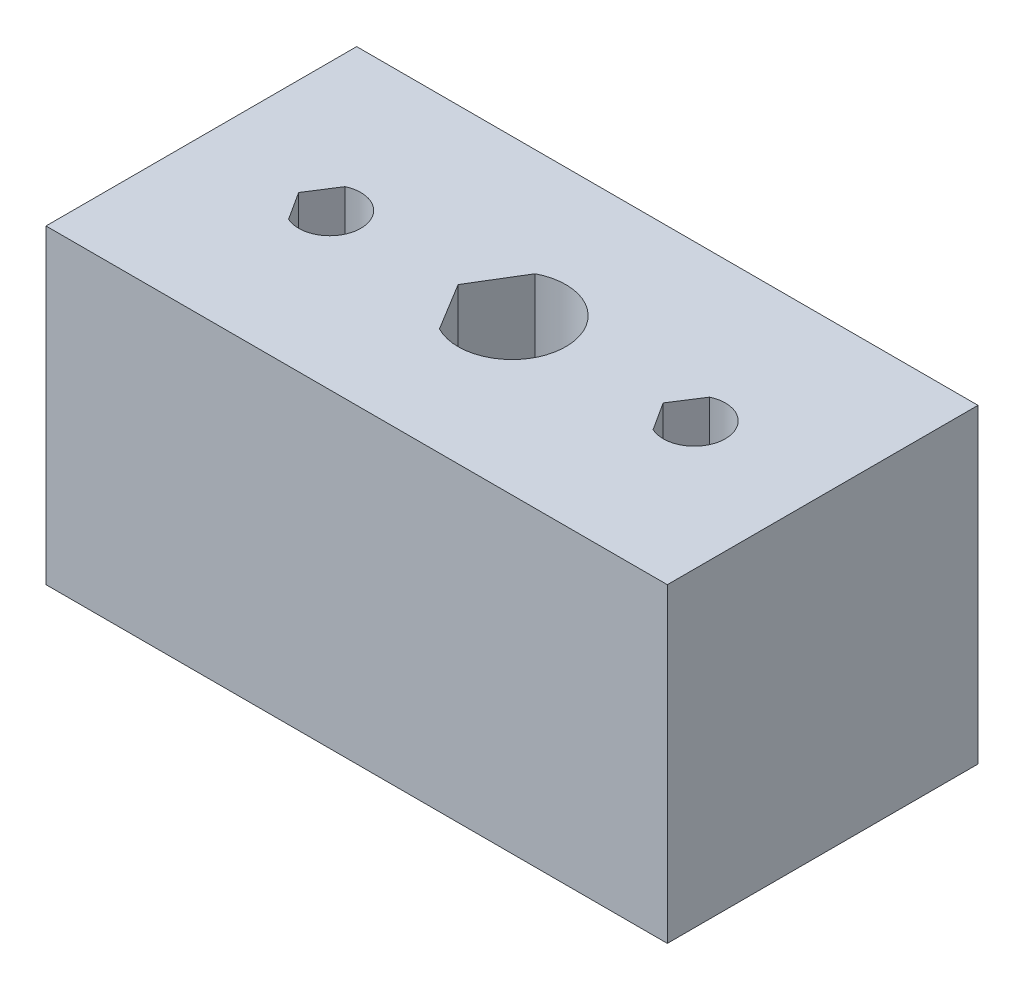
ISO-10303-21;
HEADER;
FILE_DESCRIPTION(('STEP AP214'),'2;1');
FILE_NAME('part.step','',(''),(''),'','','');
FILE_SCHEMA(('AUTOMOTIVE_DESIGN { 1 0 10303 214 1 1 1 1 }'));
ENDSEC;
DATA;
#1=APPLICATION_CONTEXT('core data for automotive mechanical design processes');
#2=APPLICATION_PROTOCOL_DEFINITION('international standard','automotive_design',2000,#1);
#3=PRODUCT_CONTEXT('',#1,'mechanical');
#4=PRODUCT('Part','Part','',(#3));
#5=PRODUCT_RELATED_PRODUCT_CATEGORY('part','',(#4));
#6=PRODUCT_DEFINITION_FORMATION('','',#4);
#7=PRODUCT_DEFINITION_CONTEXT('part definition',#1,'design');
#8=PRODUCT_DEFINITION('design','',#6,#7);
#9=PRODUCT_DEFINITION_SHAPE('','',#8);
#10=(LENGTH_UNIT() NAMED_UNIT(*) SI_UNIT(.MILLI.,.METRE.));
#11=(NAMED_UNIT(*) PLANE_ANGLE_UNIT() SI_UNIT($,.RADIAN.));
#12=(NAMED_UNIT(*) SI_UNIT($,.STERADIAN.) SOLID_ANGLE_UNIT());
#13=UNCERTAINTY_MEASURE_WITH_UNIT(LENGTH_MEASURE(1.E-05),#10,'distance_accuracy_value','');
#14=(GEOMETRIC_REPRESENTATION_CONTEXT(3) GLOBAL_UNCERTAINTY_ASSIGNED_CONTEXT((#13)) GLOBAL_UNIT_ASSIGNED_CONTEXT((#10,
#11,#12)) REPRESENTATION_CONTEXT('',''));
#15=CARTESIAN_POINT('',(0.,0.,0.));
#16=DIRECTION('',(0.,0.,1.));
#17=DIRECTION('',(1.,0.,0.));
#18=AXIS2_PLACEMENT_3D('',#15,#16,#17);
#19=CARTESIAN_POINT('',(15.,15.,7.5));
#20=DIRECTION('',(-1.,0.,0.));
#21=DIRECTION('',(0.,0.,1.));
#22=AXIS2_PLACEMENT_3D('',#19,#20,#21);
#23=PLANE('',#22);
#24=DIRECTION('',(0.,0.,-1.));
#25=VECTOR('',#24,1.);
#26=CARTESIAN_POINT('',(15.,0.,7.5));
#27=LINE('',#26,#25);
#28=CARTESIAN_POINT('',(15.,0.,7.5));
#29=VERTEX_POINT('',#28);
#30=CARTESIAN_POINT('',(15.,0.,-7.5));
#31=VERTEX_POINT('',#30);
#32=EDGE_CURVE('E200',#29,#31,#27,.T.);
#33=ORIENTED_EDGE('',*,*,#32,.T.);
#34=DIRECTION('',(0.,-1.,0.));
#35=VECTOR('',#34,1.);
#36=CARTESIAN_POINT('',(15.,15.,-7.5));
#37=LINE('',#36,#35);
#38=CARTESIAN_POINT('',(15.,15.,-7.5));
#39=VERTEX_POINT('',#38);
#40=EDGE_CURVE('E11',#39,#31,#37,.T.);
#41=ORIENTED_EDGE('',*,*,#40,.F.);
#42=DIRECTION('',(0.,0.,-1.));
#43=VECTOR('',#42,1.);
#44=CARTESIAN_POINT('',(15.,15.,7.5));
#45=LINE('',#44,#43);
#46=CARTESIAN_POINT('',(15.,15.,7.5));
#47=VERTEX_POINT('',#46);
#48=EDGE_CURVE('E205',#47,#39,#45,.T.);
#49=ORIENTED_EDGE('',*,*,#48,.F.);
#50=DIRECTION('',(0.,-1.,0.));
#51=VECTOR('',#50,1.);
#52=CARTESIAN_POINT('',(15.,15.,7.5));
#53=LINE('',#52,#51);
#54=EDGE_CURVE('E215',#47,#29,#53,.T.);
#55=ORIENTED_EDGE('',*,*,#54,.T.);
#56=EDGE_LOOP('',(#33,#41,#49,#55));
#57=FACE_BOUND('',#56,.T.);
#58=ADVANCED_FACE('F35',(#57),#23,.F.);
#59=CARTESIAN_POINT('',(-15.,15.,-7.5));
#60=DIRECTION('',(0.,0.,1.));
#61=DIRECTION('',(1.,0.,0.));
#62=AXIS2_PLACEMENT_3D('',#59,#60,#61);
#63=PLANE('',#62);
#64=DIRECTION('',(-1.,0.,0.));
#65=VECTOR('',#64,1.);
#66=CARTESIAN_POINT('',(-15.,0.,-7.5));
#67=LINE('',#66,#65);
#68=CARTESIAN_POINT('',(-15.,0.,-7.5));
#69=VERTEX_POINT('',#68);
#70=EDGE_CURVE('E218',#31,#69,#67,.T.);
#71=ORIENTED_EDGE('',*,*,#70,.T.);
#72=DIRECTION('',(0.,-1.,0.));
#73=VECTOR('',#72,1.);
#74=CARTESIAN_POINT('',(-15.,15.,-7.5));
#75=LINE('',#74,#73);
#76=CARTESIAN_POINT('',(-15.,15.,-7.5));
#77=VERTEX_POINT('',#76);
#78=EDGE_CURVE('E42',#77,#69,#75,.T.);
#79=ORIENTED_EDGE('',*,*,#78,.F.);
#80=DIRECTION('',(-1.,0.,0.));
#81=VECTOR('',#80,1.);
#82=CARTESIAN_POINT('',(-15.,15.,-7.5));
#83=LINE('',#82,#81);
#84=EDGE_CURVE('E208',#39,#77,#83,.T.);
#85=ORIENTED_EDGE('',*,*,#84,.F.);
#86=ORIENTED_EDGE('',*,*,#40,.T.);
#87=EDGE_LOOP('',(#71,#79,#85,#86));
#88=FACE_BOUND('',#87,.T.);
#89=ADVANCED_FACE('F247',(#88),#63,.F.);
#90=CARTESIAN_POINT('',(-15.,15.,7.5));
#91=DIRECTION('',(1.,0.,0.));
#92=DIRECTION('',(0.,0.,-1.));
#93=AXIS2_PLACEMENT_3D('',#90,#91,#92);
#94=PLANE('',#93);
#95=DIRECTION('',(0.,0.,1.));
#96=VECTOR('',#95,1.);
#97=CARTESIAN_POINT('',(-15.,0.,7.5));
#98=LINE('',#97,#96);
#99=CARTESIAN_POINT('',(-15.,0.,7.5));
#100=VERTEX_POINT('',#99);
#101=EDGE_CURVE('E220',#69,#100,#98,.T.);
#102=ORIENTED_EDGE('',*,*,#101,.T.);
#103=DIRECTION('',(0.,-1.,0.));
#104=VECTOR('',#103,1.);
#105=CARTESIAN_POINT('',(-15.,15.,7.5));
#106=LINE('',#105,#104);
#107=CARTESIAN_POINT('',(-15.,15.,7.5));
#108=VERTEX_POINT('',#107);
#109=EDGE_CURVE('E225',#108,#100,#106,.T.);
#110=ORIENTED_EDGE('',*,*,#109,.F.);
#111=DIRECTION('',(0.,0.,1.));
#112=VECTOR('',#111,1.);
#113=CARTESIAN_POINT('',(-15.,15.,7.5));
#114=LINE('',#113,#112);
#115=EDGE_CURVE('E211',#77,#108,#114,.T.);
#116=ORIENTED_EDGE('',*,*,#115,.F.);
#117=ORIENTED_EDGE('',*,*,#78,.T.);
#118=EDGE_LOOP('',(#102,#110,#116,#117));
#119=FACE_BOUND('',#118,.T.);
#120=ADVANCED_FACE('F232',(#119),#94,.F.);
#121=CARTESIAN_POINT('',(-15.,15.,7.5));
#122=DIRECTION('',(0.,0.,-1.));
#123=DIRECTION('',(-1.,0.,0.));
#124=AXIS2_PLACEMENT_3D('',#121,#122,#123);
#125=PLANE('',#124);
#126=DIRECTION('',(1.,0.,0.));
#127=VECTOR('',#126,1.);
#128=CARTESIAN_POINT('',(-15.,0.,7.5));
#129=LINE('',#128,#127);
#130=EDGE_CURVE('E209',#100,#29,#129,.T.);
#131=ORIENTED_EDGE('',*,*,#130,.T.);
#132=ORIENTED_EDGE('',*,*,#54,.F.);
#133=DIRECTION('',(1.,0.,0.));
#134=VECTOR('',#133,1.);
#135=CARTESIAN_POINT('',(-15.,15.,7.5));
#136=LINE('',#135,#134);
#137=EDGE_CURVE('E213',#108,#47,#136,.T.);
#138=ORIENTED_EDGE('',*,*,#137,.F.);
#139=ORIENTED_EDGE('',*,*,#109,.T.);
#140=EDGE_LOOP('',(#131,#132,#138,#139));
#141=FACE_BOUND('',#140,.T.);
#142=ADVANCED_FACE('F240',(#141),#125,.F.);
#143=CARTESIAN_POINT('',(0.,15.,0.));
#144=DIRECTION('',(0.,-1.,0.));
#145=DIRECTION('',(0.,0.,-1.));
#146=AXIS2_PLACEMENT_3D('',#143,#144,#145);
#147=PLANE('',#146);
#148=DIRECTION('',(0.540131543263208,0.,0.841580605748555));
#149=VECTOR('',#148,1.);
#150=CARTESIAN_POINT('',(-10.3,15.,0.));
#151=LINE('',#150,#149);
#152=CARTESIAN_POINT('',(-10.3,15.,0.));
#153=VERTEX_POINT('',#152);
#154=CARTESIAN_POINT('',(-9.42477374791632,15.,1.36369269409006));
#155=VERTEX_POINT('',#154);
#156=EDGE_CURVE('E147',#153,#155,#151,.T.);
#157=ORIENTED_EDGE('',*,*,#156,.F.);
#158=DIRECTION('',(-0.540131543263208,0.,0.841580605748555));
#159=VECTOR('',#158,1.);
#160=CARTESIAN_POINT('',(-10.3,15.,0.));
#161=LINE('',#160,#159);
#162=CARTESIAN_POINT('',(-9.42477374791632,15.,-1.36369269409006));
#163=VERTEX_POINT('',#162);
#164=EDGE_CURVE('E49',#163,#153,#161,.T.);
#165=ORIENTED_EDGE('',*,*,#164,.F.);
#166=CARTESIAN_POINT('',(-8.8,15.,0.));
#167=DIRECTION('',(0.,1.,0.));
#168=DIRECTION('',(0.,0.,1.));
#169=AXIS2_PLACEMENT_3D('',#166,#167,#168);
#170=CIRCLE('',#169,1.5);
#171=EDGE_CURVE('E144',#155,#163,#170,.T.);
#172=ORIENTED_EDGE('',*,*,#171,.F.);
#173=EDGE_LOOP('',(#157,#165,#172));
#174=FACE_BOUND('',#173,.T.);
#175=DIRECTION('',(0.519782127655013,0.,0.854298858579612));
#176=VECTOR('',#175,1.);
#177=CARTESIAN_POINT('',(-2.6,15.,0.));
#178=LINE('',#177,#176);
#179=CARTESIAN_POINT('',(-2.6,15.,0.));
#180=VERTEX_POINT('',#179);
#181=CARTESIAN_POINT('',(-1.19509800680622,15.,2.30905624750195));
#182=VERTEX_POINT('',#181);
#183=EDGE_CURVE('E169',#180,#182,#178,.T.);
#184=ORIENTED_EDGE('',*,*,#183,.F.);
#185=DIRECTION('',(-0.519782127655013,0.,0.854298858579612));
#186=VECTOR('',#185,1.);
#187=CARTESIAN_POINT('',(-2.6,15.,0.));
#188=LINE('',#187,#186);
#189=CARTESIAN_POINT('',(-1.19509800680622,15.,-2.30905624750195));
#190=VERTEX_POINT('',#189);
#191=EDGE_CURVE('E155',#190,#180,#188,.T.);
#192=ORIENTED_EDGE('',*,*,#191,.F.);
#193=CARTESIAN_POINT('',(0.,15.,0.));
#194=DIRECTION('',(0.,1.,0.));
#195=DIRECTION('',(0.,0.,1.));
#196=AXIS2_PLACEMENT_3D('',#193,#194,#195);
#197=CIRCLE('',#196,2.6);
#198=EDGE_CURVE('E161',#182,#190,#197,.T.);
#199=ORIENTED_EDGE('',*,*,#198,.F.);
#200=EDGE_LOOP('',(#184,#192,#199));
#201=FACE_BOUND('',#200,.T.);
#202=DIRECTION('',(0.540131543263208,0.,0.841580605748555));
#203=VECTOR('',#202,1.);
#204=CARTESIAN_POINT('',(7.3,15.,0.));
#205=LINE('',#204,#203);
#206=CARTESIAN_POINT('',(7.3,15.,0.));
#207=VERTEX_POINT('',#206);
#208=CARTESIAN_POINT('',(8.17522625208368,15.,1.36369269409006));
#209=VERTEX_POINT('',#208);
#210=EDGE_CURVE('E193',#207,#209,#205,.T.);
#211=ORIENTED_EDGE('',*,*,#210,.F.);
#212=DIRECTION('',(-0.540131543263208,0.,0.841580605748555));
#213=VECTOR('',#212,1.);
#214=CARTESIAN_POINT('',(7.3,15.,0.));
#215=LINE('',#214,#213);
#216=CARTESIAN_POINT('',(8.17522625208368,15.,-1.36369269409006));
#217=VERTEX_POINT('',#216);
#218=EDGE_CURVE('E176',#217,#207,#215,.T.);
#219=ORIENTED_EDGE('',*,*,#218,.F.);
#220=CARTESIAN_POINT('',(8.8,15.,0.));
#221=DIRECTION('',(0.,1.,0.));
#222=DIRECTION('',(0.,0.,1.));
#223=AXIS2_PLACEMENT_3D('',#220,#221,#222);
#224=CIRCLE('',#223,1.5);
#225=EDGE_CURVE('E185',#209,#217,#224,.T.);
#226=ORIENTED_EDGE('',*,*,#225,.F.);
#227=EDGE_LOOP('',(#211,#219,#226));
#228=FACE_BOUND('',#227,.T.);
#229=ORIENTED_EDGE('',*,*,#48,.T.);
#230=ORIENTED_EDGE('',*,*,#84,.T.);
#231=ORIENTED_EDGE('',*,*,#115,.T.);
#232=ORIENTED_EDGE('',*,*,#137,.T.);
#233=EDGE_LOOP('',(#229,#230,#231,#232));
#234=FACE_BOUND('',#233,.T.);
#235=ADVANCED_FACE('F246',(#174,#201,#228,#234),#147,.F.);
#236=CARTESIAN_POINT('',(0.,0.,0.));
#237=DIRECTION('',(0.,-1.,0.));
#238=DIRECTION('',(0.,0.,-1.));
#239=AXIS2_PLACEMENT_3D('',#236,#237,#238);
#240=PLANE('',#239);
#241=DIRECTION('',(-0.540131543263208,0.,0.841580605748555));
#242=VECTOR('',#241,1.);
#243=CARTESIAN_POINT('',(-10.3,0.,0.));
#244=LINE('',#243,#242);
#245=CARTESIAN_POINT('',(-9.42477374791632,0.,-1.36369269409006));
#246=VERTEX_POINT('',#245);
#247=CARTESIAN_POINT('',(-10.3,0.,0.));
#248=VERTEX_POINT('',#247);
#249=EDGE_CURVE('E131',#246,#248,#244,.T.);
#250=ORIENTED_EDGE('',*,*,#249,.T.);
#251=DIRECTION('',(0.540131543263208,0.,0.841580605748555));
#252=VECTOR('',#251,1.);
#253=CARTESIAN_POINT('',(-10.3,0.,0.));
#254=LINE('',#253,#252);
#255=CARTESIAN_POINT('',(-9.42477374791632,0.,1.36369269409006));
#256=VERTEX_POINT('',#255);
#257=EDGE_CURVE('E138',#248,#256,#254,.T.);
#258=ORIENTED_EDGE('',*,*,#257,.T.);
#259=CARTESIAN_POINT('',(-8.8,0.,0.));
#260=DIRECTION('',(0.,1.,0.));
#261=DIRECTION('',(0.,0.,1.));
#262=AXIS2_PLACEMENT_3D('',#259,#260,#261);
#263=CIRCLE('',#262,1.5);
#264=EDGE_CURVE('E57',#256,#246,#263,.T.);
#265=ORIENTED_EDGE('',*,*,#264,.T.);
#266=EDGE_LOOP('',(#250,#258,#265));
#267=FACE_BOUND('',#266,.T.);
#268=DIRECTION('',(-0.519782127655013,0.,0.854298858579612));
#269=VECTOR('',#268,1.);
#270=CARTESIAN_POINT('',(-2.6,0.,0.));
#271=LINE('',#270,#269);
#272=CARTESIAN_POINT('',(-1.19509800680622,0.,-2.30905624750195));
#273=VERTEX_POINT('',#272);
#274=CARTESIAN_POINT('',(-2.6,0.,0.));
#275=VERTEX_POINT('',#274);
#276=EDGE_CURVE('E157',#273,#275,#271,.T.);
#277=ORIENTED_EDGE('',*,*,#276,.T.);
#278=DIRECTION('',(0.519782127655013,0.,0.854298858579612));
#279=VECTOR('',#278,1.);
#280=CARTESIAN_POINT('',(-2.6,0.,0.));
#281=LINE('',#280,#279);
#282=CARTESIAN_POINT('',(-1.19509800680622,0.,2.30905624750195));
#283=VERTEX_POINT('',#282);
#284=EDGE_CURVE('E160',#275,#283,#281,.T.);
#285=ORIENTED_EDGE('',*,*,#284,.T.);
#286=CARTESIAN_POINT('',(0.,0.,0.));
#287=DIRECTION('',(0.,1.,0.));
#288=DIRECTION('',(0.,0.,1.));
#289=AXIS2_PLACEMENT_3D('',#286,#287,#288);
#290=CIRCLE('',#289,2.6);
#291=EDGE_CURVE('E164',#283,#273,#290,.T.);
#292=ORIENTED_EDGE('',*,*,#291,.T.);
#293=EDGE_LOOP('',(#277,#285,#292));
#294=FACE_BOUND('',#293,.T.);
#295=DIRECTION('',(-0.540131543263208,0.,0.841580605748555));
#296=VECTOR('',#295,1.);
#297=CARTESIAN_POINT('',(7.3,0.,0.));
#298=LINE('',#297,#296);
#299=CARTESIAN_POINT('',(8.17522625208368,0.,-1.36369269409006));
#300=VERTEX_POINT('',#299);
#301=CARTESIAN_POINT('',(7.3,0.,0.));
#302=VERTEX_POINT('',#301);
#303=EDGE_CURVE('E181',#300,#302,#298,.T.);
#304=ORIENTED_EDGE('',*,*,#303,.T.);
#305=DIRECTION('',(0.540131543263208,0.,0.841580605748555));
#306=VECTOR('',#305,1.);
#307=CARTESIAN_POINT('',(7.3,0.,0.));
#308=LINE('',#307,#306);
#309=CARTESIAN_POINT('',(8.17522625208368,0.,1.36369269409006));
#310=VERTEX_POINT('',#309);
#311=EDGE_CURVE('E184',#302,#310,#308,.T.);
#312=ORIENTED_EDGE('',*,*,#311,.T.);
#313=CARTESIAN_POINT('',(8.8,0.,0.));
#314=DIRECTION('',(0.,1.,0.));
#315=DIRECTION('',(0.,0.,1.));
#316=AXIS2_PLACEMENT_3D('',#313,#314,#315);
#317=CIRCLE('',#316,1.5);
#318=EDGE_CURVE('E188',#310,#300,#317,.T.);
#319=ORIENTED_EDGE('',*,*,#318,.T.);
#320=EDGE_LOOP('',(#304,#312,#319));
#321=FACE_BOUND('',#320,.T.);
#322=ORIENTED_EDGE('',*,*,#32,.F.);
#323=ORIENTED_EDGE('',*,*,#130,.F.);
#324=ORIENTED_EDGE('',*,*,#101,.F.);
#325=ORIENTED_EDGE('',*,*,#70,.F.);
#326=EDGE_LOOP('',(#322,#323,#324,#325));
#327=FACE_BOUND('',#326,.T.);
#328=ADVANCED_FACE('F142',(#267,#294,#321,#327),#240,.T.);
#329=CARTESIAN_POINT('',(7.3,0.,0.));
#330=DIRECTION('',(-0.841580605748555,0.,-0.540131543263208));
#331=DIRECTION('',(-0.540131543263208,0.,0.841580605748555));
#332=AXIS2_PLACEMENT_3D('',#329,#330,#331);
#333=PLANE('',#332);
#334=ORIENTED_EDGE('',*,*,#218,.T.);
#335=DIRECTION('',(0.,1.,0.));
#336=VECTOR('',#335,1.);
#337=CARTESIAN_POINT('',(7.3,0.,0.));
#338=LINE('',#337,#336);
#339=EDGE_CURVE('E191',#302,#207,#338,.T.);
#340=ORIENTED_EDGE('',*,*,#339,.F.);
#341=ORIENTED_EDGE('',*,*,#303,.F.);
#342=DIRECTION('',(0.,1.,0.));
#343=VECTOR('',#342,1.);
#344=CARTESIAN_POINT('',(8.17522625208368,0.,-1.36369269409006));
#345=LINE('',#344,#343);
#346=EDGE_CURVE('E198',#300,#217,#345,.T.);
#347=ORIENTED_EDGE('',*,*,#346,.T.);
#348=EDGE_LOOP('',(#334,#340,#341,#347));
#349=FACE_BOUND('',#348,.T.);
#350=ADVANCED_FACE('F259',(#349),#333,.F.);
#351=CARTESIAN_POINT('',(8.8,0.,0.));
#352=DIRECTION('',(0.,1.,0.));
#353=DIRECTION('',(0.,0.,1.));
#354=AXIS2_PLACEMENT_3D('',#351,#352,#353);
#355=CYLINDRICAL_SURFACE('',#354,1.5);
#356=ORIENTED_EDGE('',*,*,#225,.T.);
#357=ORIENTED_EDGE('',*,*,#346,.F.);
#358=ORIENTED_EDGE('',*,*,#318,.F.);
#359=DIRECTION('',(0.,1.,0.));
#360=VECTOR('',#359,1.);
#361=CARTESIAN_POINT('',(8.17522625208368,0.,1.36369269409006));
#362=LINE('',#361,#360);
#363=EDGE_CURVE('E201',#310,#209,#362,.T.);
#364=ORIENTED_EDGE('',*,*,#363,.T.);
#365=EDGE_LOOP('',(#356,#357,#358,#364));
#366=FACE_BOUND('',#365,.T.);
#367=ADVANCED_FACE('F265',(#366),#355,.F.);
#368=CARTESIAN_POINT('',(7.3,0.,0.));
#369=DIRECTION('',(-0.841580605748555,0.,0.540131543263208));
#370=DIRECTION('',(0.540131543263208,0.,0.841580605748555));
#371=AXIS2_PLACEMENT_3D('',#368,#369,#370);
#372=PLANE('',#371);
#373=ORIENTED_EDGE('',*,*,#210,.T.);
#374=ORIENTED_EDGE('',*,*,#363,.F.);
#375=ORIENTED_EDGE('',*,*,#311,.F.);
#376=ORIENTED_EDGE('',*,*,#339,.T.);
#377=EDGE_LOOP('',(#373,#374,#375,#376));
#378=FACE_BOUND('',#377,.T.);
#379=ADVANCED_FACE('F267',(#378),#372,.F.);
#380=CARTESIAN_POINT('',(-2.6,0.,0.));
#381=DIRECTION('',(-0.854298858579612,0.,-0.519782127655013));
#382=DIRECTION('',(-0.519782127655013,0.,0.854298858579612));
#383=AXIS2_PLACEMENT_3D('',#380,#381,#382);
#384=PLANE('',#383);
#385=ORIENTED_EDGE('',*,*,#191,.T.);
#386=DIRECTION('',(0.,1.,0.));
#387=VECTOR('',#386,1.);
#388=CARTESIAN_POINT('',(-2.6,0.,0.));
#389=LINE('',#388,#387);
#390=EDGE_CURVE('E167',#275,#180,#389,.T.);
#391=ORIENTED_EDGE('',*,*,#390,.F.);
#392=ORIENTED_EDGE('',*,*,#276,.F.);
#393=DIRECTION('',(0.,1.,0.));
#394=VECTOR('',#393,1.);
#395=CARTESIAN_POINT('',(-1.19509800680622,0.,-2.30905624750195));
#396=LINE('',#395,#394);
#397=EDGE_CURVE('E174',#273,#190,#396,.T.);
#398=ORIENTED_EDGE('',*,*,#397,.T.);
#399=EDGE_LOOP('',(#385,#391,#392,#398));
#400=FACE_BOUND('',#399,.T.);
#401=ADVANCED_FACE('F270',(#400),#384,.F.);
#402=CARTESIAN_POINT('',(0.,0.,0.));
#403=DIRECTION('',(0.,1.,0.));
#404=DIRECTION('',(0.,0.,1.));
#405=AXIS2_PLACEMENT_3D('',#402,#403,#404);
#406=CYLINDRICAL_SURFACE('',#405,2.6);
#407=ORIENTED_EDGE('',*,*,#198,.T.);
#408=ORIENTED_EDGE('',*,*,#397,.F.);
#409=ORIENTED_EDGE('',*,*,#291,.F.);
#410=DIRECTION('',(0.,1.,0.));
#411=VECTOR('',#410,1.);
#412=CARTESIAN_POINT('',(-1.19509800680622,0.,2.30905624750195));
#413=LINE('',#412,#411);
#414=EDGE_CURVE('E177',#283,#182,#413,.T.);
#415=ORIENTED_EDGE('',*,*,#414,.T.);
#416=EDGE_LOOP('',(#407,#408,#409,#415));
#417=FACE_BOUND('',#416,.T.);
#418=ADVANCED_FACE('F277',(#417),#406,.F.);
#419=CARTESIAN_POINT('',(-2.6,0.,0.));
#420=DIRECTION('',(-0.854298858579612,0.,0.519782127655013));
#421=DIRECTION('',(0.519782127655013,0.,0.854298858579612));
#422=AXIS2_PLACEMENT_3D('',#419,#420,#421);
#423=PLANE('',#422);
#424=ORIENTED_EDGE('',*,*,#183,.T.);
#425=ORIENTED_EDGE('',*,*,#414,.F.);
#426=ORIENTED_EDGE('',*,*,#284,.F.);
#427=ORIENTED_EDGE('',*,*,#390,.T.);
#428=EDGE_LOOP('',(#424,#425,#426,#427));
#429=FACE_BOUND('',#428,.T.);
#430=ADVANCED_FACE('F279',(#429),#423,.F.);
#431=CARTESIAN_POINT('',(-10.3,0.,0.));
#432=DIRECTION('',(-0.841580605748555,0.,-0.540131543263208));
#433=DIRECTION('',(-0.540131543263208,0.,0.841580605748555));
#434=AXIS2_PLACEMENT_3D('',#431,#432,#433);
#435=PLANE('',#434);
#436=ORIENTED_EDGE('',*,*,#164,.T.);
#437=DIRECTION('',(0.,1.,0.));
#438=VECTOR('',#437,1.);
#439=CARTESIAN_POINT('',(-10.3,0.,0.));
#440=LINE('',#439,#438);
#441=EDGE_CURVE('E127',#248,#153,#440,.T.);
#442=ORIENTED_EDGE('',*,*,#441,.F.);
#443=ORIENTED_EDGE('',*,*,#249,.F.);
#444=DIRECTION('',(0.,1.,0.));
#445=VECTOR('',#444,1.);
#446=CARTESIAN_POINT('',(-9.42477374791632,0.,-1.36369269409006));
#447=LINE('',#446,#445);
#448=EDGE_CURVE('E153',#246,#163,#447,.T.);
#449=ORIENTED_EDGE('',*,*,#448,.T.);
#450=EDGE_LOOP('',(#436,#442,#443,#449));
#451=FACE_BOUND('',#450,.T.);
#452=ADVANCED_FACE('F129',(#451),#435,.F.);
#453=CARTESIAN_POINT('',(-8.8,0.,0.));
#454=DIRECTION('',(0.,1.,0.));
#455=DIRECTION('',(0.,0.,1.));
#456=AXIS2_PLACEMENT_3D('',#453,#454,#455);
#457=CYLINDRICAL_SURFACE('',#456,1.5);
#458=ORIENTED_EDGE('',*,*,#171,.T.);
#459=ORIENTED_EDGE('',*,*,#448,.F.);
#460=ORIENTED_EDGE('',*,*,#264,.F.);
#461=DIRECTION('',(0.,1.,0.));
#462=VECTOR('',#461,1.);
#463=CARTESIAN_POINT('',(-9.42477374791632,0.,1.36369269409006));
#464=LINE('',#463,#462);
#465=EDGE_CURVE('E135',#256,#155,#464,.T.);
#466=ORIENTED_EDGE('',*,*,#465,.T.);
#467=EDGE_LOOP('',(#458,#459,#460,#466));
#468=FACE_BOUND('',#467,.T.);
#469=ADVANCED_FACE('F288',(#468),#457,.F.);
#470=CARTESIAN_POINT('',(-10.3,0.,0.));
#471=DIRECTION('',(-0.841580605748555,0.,0.540131543263208));
#472=DIRECTION('',(0.540131543263208,0.,0.841580605748555));
#473=AXIS2_PLACEMENT_3D('',#470,#471,#472);
#474=PLANE('',#473);
#475=ORIENTED_EDGE('',*,*,#156,.T.);
#476=ORIENTED_EDGE('',*,*,#465,.F.);
#477=ORIENTED_EDGE('',*,*,#257,.F.);
#478=ORIENTED_EDGE('',*,*,#441,.T.);
#479=EDGE_LOOP('',(#475,#476,#477,#478));
#480=FACE_BOUND('',#479,.T.);
#481=ADVANCED_FACE('F139',(#480),#474,.F.);
#482=CLOSED_SHELL('',(#58,#89,#120,#142,#235,#328,#350,#367,#379,#401,#418,#430,#452,#469,#481));
#483=MANIFOLD_SOLID_BREP('B2',#482);
#484=ADVANCED_BREP_SHAPE_REPRESENTATION('',(#18,#483),#14);
#485=SHAPE_DEFINITION_REPRESENTATION(#9,#484);
ENDSEC;
END-ISO-10303-21;
